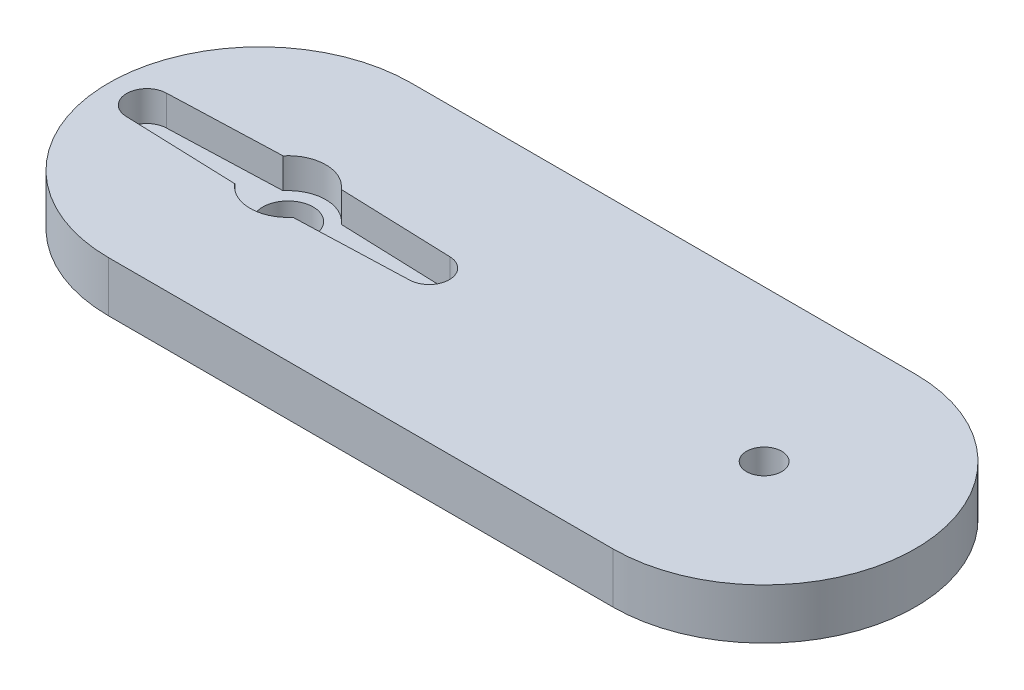
ISO-10303-21;
HEADER;
FILE_DESCRIPTION(('STEP AP214'),'2;1');
FILE_NAME('part.step','',(''),(''),'','','');
FILE_SCHEMA(('AUTOMOTIVE_DESIGN { 1 0 10303 214 1 1 1 1 }'));
ENDSEC;
DATA;
#1=APPLICATION_CONTEXT('core data for automotive mechanical design processes');
#2=APPLICATION_PROTOCOL_DEFINITION('international standard','automotive_design',2000,#1);
#3=PRODUCT_CONTEXT('',#1,'mechanical');
#4=PRODUCT('Part','Part','',(#3));
#5=PRODUCT_RELATED_PRODUCT_CATEGORY('part','',(#4));
#6=PRODUCT_DEFINITION_FORMATION('','',#4);
#7=PRODUCT_DEFINITION_CONTEXT('part definition',#1,'design');
#8=PRODUCT_DEFINITION('design','',#6,#7);
#9=PRODUCT_DEFINITION_SHAPE('','',#8);
#10=(LENGTH_UNIT() NAMED_UNIT(*) SI_UNIT(.MILLI.,.METRE.));
#11=(NAMED_UNIT(*) PLANE_ANGLE_UNIT() SI_UNIT($,.RADIAN.));
#12=(NAMED_UNIT(*) SI_UNIT($,.STERADIAN.) SOLID_ANGLE_UNIT());
#13=UNCERTAINTY_MEASURE_WITH_UNIT(LENGTH_MEASURE(1.E-05),#10,'distance_accuracy_value','');
#14=(GEOMETRIC_REPRESENTATION_CONTEXT(3) GLOBAL_UNCERTAINTY_ASSIGNED_CONTEXT((#13)) GLOBAL_UNIT_ASSIGNED_CONTEXT((#10,
#11,#12)) REPRESENTATION_CONTEXT('',''));
#15=CARTESIAN_POINT('',(0.,0.,0.));
#16=DIRECTION('',(0.,0.,1.));
#17=DIRECTION('',(1.,0.,0.));
#18=AXIS2_PLACEMENT_3D('',#15,#16,#17);
#19=CARTESIAN_POINT('',(0.,5.,0.));
#20=DIRECTION('',(0.,-1.,0.));
#21=DIRECTION('',(0.,0.,-1.));
#22=AXIS2_PLACEMENT_3D('',#19,#20,#21);
#23=PLANE('',#22);
#24=CARTESIAN_POINT('',(0.,5.,0.));
#25=DIRECTION('',(0.,1.,0.));
#26=DIRECTION('',(0.,0.,-1.));
#27=AXIS2_PLACEMENT_3D('',#24,#25,#26);
#28=CIRCLE('',#27,15.);
#29=CARTESIAN_POINT('',(0.,5.,15.));
#30=VERTEX_POINT('',#29);
#31=CARTESIAN_POINT('',(0.,5.,-15.));
#32=VERTEX_POINT('',#31);
#33=EDGE_CURVE('E243',#30,#32,#28,.T.);
#34=ORIENTED_EDGE('',*,*,#33,.T.);
#35=DIRECTION('',(-1.,0.,0.));
#36=VECTOR('',#35,1.);
#37=CARTESIAN_POINT('',(-50.,5.,-15.));
#38=LINE('',#37,#36);
#39=CARTESIAN_POINT('',(-50.,5.,-15.));
#40=VERTEX_POINT('',#39);
#41=EDGE_CURVE('E97',#32,#40,#38,.T.);
#42=ORIENTED_EDGE('',*,*,#41,.T.);
#43=CARTESIAN_POINT('',(-50.,5.,0.));
#44=DIRECTION('',(0.,1.,0.));
#45=DIRECTION('',(0.,0.,1.));
#46=AXIS2_PLACEMENT_3D('',#43,#44,#45);
#47=CIRCLE('',#46,15.);
#48=CARTESIAN_POINT('',(-50.,5.,15.));
#49=VERTEX_POINT('',#48);
#50=EDGE_CURVE('E248',#40,#49,#47,.T.);
#51=ORIENTED_EDGE('',*,*,#50,.T.);
#52=DIRECTION('',(1.,0.,0.));
#53=VECTOR('',#52,1.);
#54=CARTESIAN_POINT('',(-50.,5.,15.));
#55=LINE('',#54,#53);
#56=EDGE_CURVE('E69',#49,#30,#55,.T.);
#57=ORIENTED_EDGE('',*,*,#56,.T.);
#58=EDGE_LOOP('',(#34,#42,#51,#57));
#59=FACE_BOUND('',#58,.T.);
#60=CARTESIAN_POINT('',(0.,5.,0.));
#61=DIRECTION('',(0.,1.,0.));
#62=DIRECTION('',(0.,0.,-1.));
#63=AXIS2_PLACEMENT_3D('',#60,#61,#62);
#64=CIRCLE('',#63,1.75);
#65=CARTESIAN_POINT('',(0.,5.,-1.75000000000001));
#66=VERTEX_POINT('',#65);
#67=EDGE_CURVE('E222',#66,#66,#64,.T.);
#68=ORIENTED_EDGE('',*,*,#67,.F.);
#69=EDGE_LOOP('',(#68));
#70=FACE_BOUND('',#69,.T.);
#71=CARTESIAN_POINT('',(-61.2106377870323,5.,0.));
#72=DIRECTION('',(0.,1.,0.));
#73=DIRECTION('',(0.,0.,1.));
#74=AXIS2_PLACEMENT_3D('',#71,#72,#73);
#75=CIRCLE('',#74,1.99999999999989);
#76=CARTESIAN_POINT('',(-61.2814656274018,5.,1.99874546078984));
#77=VERTEX_POINT('',#76);
#78=CARTESIAN_POINT('',(-61.2814656274019,5.,-1.99874546078982));
#79=VERTEX_POINT('',#78);
#80=EDGE_CURVE('E60',#77,#79,#75,.F.);
#81=ORIENTED_EDGE('',*,*,#80,.T.);
#82=DIRECTION('',(0.999372730394993,0.,-0.0354139201848141));
#83=VECTOR('',#82,1.);
#84=CARTESIAN_POINT('',(-0.147594901167753,5.,-4.16509436409831));
#85=LINE('',#84,#83);
#86=CARTESIAN_POINT('',(-50.0961084973095,5.,-2.39511143376086));
#87=VERTEX_POINT('',#86);
#88=EDGE_CURVE('E163',#79,#87,#85,.T.);
#89=ORIENTED_EDGE('',*,*,#88,.T.);
#90=CARTESIAN_POINT('',(-47.2106377870323,5.,0.));
#91=DIRECTION('',(0.,1.,0.));
#92=DIRECTION('',(0.,0.,1.));
#93=AXIS2_PLACEMENT_3D('',#90,#91,#92);
#94=CIRCLE('',#93,3.74999999999991);
#95=CARTESIAN_POINT('',(-44.3251670767553,5.,-2.39511143376105));
#96=VERTEX_POINT('',#95);
#97=EDGE_CURVE('E212',#96,#87,#94,.T.);
#98=ORIENTED_EDGE('',*,*,#97,.F.);
#99=DIRECTION('',(-0.999372730394995,0.,-0.0354139201847496));
#100=VECTOR('',#99,1.);
#101=CARTESIAN_POINT('',(0.0291768603715252,5.,-0.823364328538849));
#102=LINE('',#101,#100);
#103=CARTESIAN_POINT('',(-33.1398099466627,5.,-1.99874546079073));
#104=VERTEX_POINT('',#103);
#105=EDGE_CURVE('E208',#104,#96,#102,.T.);
#106=ORIENTED_EDGE('',*,*,#105,.F.);
#107=CARTESIAN_POINT('',(-33.2106377870322,5.,-2.6382402541072E-12));
#108=DIRECTION('',(0.,1.,0.));
#109=DIRECTION('',(0.,0.,1.));
#110=AXIS2_PLACEMENT_3D('',#107,#108,#109);
#111=CIRCLE('',#110,1.9999999999981);
#112=CARTESIAN_POINT('',(-33.1398099466627,5.,1.99874546078946));
#113=VERTEX_POINT('',#112);
#114=EDGE_CURVE('E204',#113,#104,#111,.T.);
#115=ORIENTED_EDGE('',*,*,#114,.F.);
#116=DIRECTION('',(-0.999372730394992,0.,0.035413920184841));
#117=VECTOR('',#116,1.);
#118=CARTESIAN_POINT('',(0.0291768603714483,5.,0.823364328534549));
#119=LINE('',#118,#117);
#120=CARTESIAN_POINT('',(-44.3251670767551,5.,2.39511143376081));
#121=VERTEX_POINT('',#120);
#122=EDGE_CURVE('E200',#113,#121,#119,.T.);
#123=ORIENTED_EDGE('',*,*,#122,.T.);
#124=CARTESIAN_POINT('',(-47.2106377870323,5.,0.));
#125=DIRECTION('',(0.,1.,0.));
#126=DIRECTION('',(0.,0.,1.));
#127=AXIS2_PLACEMENT_3D('',#124,#125,#126);
#128=CIRCLE('',#127,3.74999999999992);
#129=CARTESIAN_POINT('',(-50.0961084973095,5.,2.39511143376087));
#130=VERTEX_POINT('',#129);
#131=EDGE_CURVE('E196',#130,#121,#128,.T.);
#132=ORIENTED_EDGE('',*,*,#131,.F.);
#133=DIRECTION('',(0.999372730394993,0.,0.0354139201848138));
#134=VECTOR('',#133,1.);
#135=CARTESIAN_POINT('',(-0.147594901167751,5.,4.1650943640983));
#136=LINE('',#135,#134);
#137=EDGE_CURVE('E192',#77,#130,#136,.T.);
#138=ORIENTED_EDGE('',*,*,#137,.F.);
#139=EDGE_LOOP('',(#81,#89,#98,#106,#115,#123,#132,#138));
#140=FACE_BOUND('',#139,.T.);
#141=ADVANCED_FACE('F43',(#59,#70,#140),#23,.F.);
#142=CARTESIAN_POINT('',(0.,5.,0.));
#143=DIRECTION('',(0.,-1.,0.));
#144=DIRECTION('',(0.,0.,-1.));
#145=AXIS2_PLACEMENT_3D('',#142,#143,#144);
#146=CYLINDRICAL_SURFACE('',#145,15.);
#147=CARTESIAN_POINT('',(0.,0.,0.));
#148=DIRECTION('',(0.,1.,0.));
#149=DIRECTION('',(0.,0.,-1.));
#150=AXIS2_PLACEMENT_3D('',#147,#148,#149);
#151=CIRCLE('',#150,15.);
#152=CARTESIAN_POINT('',(0.,0.,15.));
#153=VERTEX_POINT('',#152);
#154=CARTESIAN_POINT('',(0.,0.,-15.));
#155=VERTEX_POINT('',#154);
#156=EDGE_CURVE('E254',#153,#155,#151,.T.);
#157=ORIENTED_EDGE('',*,*,#156,.T.);
#158=DIRECTION('',(0.,-1.,0.));
#159=VECTOR('',#158,1.);
#160=CARTESIAN_POINT('',(0.,5.,-15.));
#161=LINE('',#160,#159);
#162=EDGE_CURVE('E11',#32,#155,#161,.T.);
#163=ORIENTED_EDGE('',*,*,#162,.F.);
#164=ORIENTED_EDGE('',*,*,#33,.F.);
#165=DIRECTION('',(0.,-1.,0.));
#166=VECTOR('',#165,1.);
#167=CARTESIAN_POINT('',(0.,5.,15.));
#168=LINE('',#167,#166);
#169=EDGE_CURVE('E253',#30,#153,#168,.T.);
#170=ORIENTED_EDGE('',*,*,#169,.T.);
#171=EDGE_LOOP('',(#157,#163,#164,#170));
#172=FACE_BOUND('',#171,.T.);
#173=ADVANCED_FACE('F45',(#172),#146,.T.);
#174=CARTESIAN_POINT('',(-50.,5.,-15.));
#175=DIRECTION('',(0.,0.,1.));
#176=DIRECTION('',(1.,0.,0.));
#177=AXIS2_PLACEMENT_3D('',#174,#175,#176);
#178=PLANE('',#177);
#179=DIRECTION('',(-1.,0.,0.));
#180=VECTOR('',#179,1.);
#181=CARTESIAN_POINT('',(-50.,0.,-15.));
#182=LINE('',#181,#180);
#183=CARTESIAN_POINT('',(-50.,0.,-15.));
#184=VERTEX_POINT('',#183);
#185=EDGE_CURVE('E258',#155,#184,#182,.T.);
#186=ORIENTED_EDGE('',*,*,#185,.T.);
#187=DIRECTION('',(0.,-1.,0.));
#188=VECTOR('',#187,1.);
#189=CARTESIAN_POINT('',(-50.,5.,-15.));
#190=LINE('',#189,#188);
#191=EDGE_CURVE('E53',#40,#184,#190,.T.);
#192=ORIENTED_EDGE('',*,*,#191,.F.);
#193=ORIENTED_EDGE('',*,*,#41,.F.);
#194=ORIENTED_EDGE('',*,*,#162,.T.);
#195=EDGE_LOOP('',(#186,#192,#193,#194));
#196=FACE_BOUND('',#195,.T.);
#197=ADVANCED_FACE('F294',(#196),#178,.F.);
#198=CARTESIAN_POINT('',(-50.,5.,0.));
#199=DIRECTION('',(0.,-1.,0.));
#200=DIRECTION('',(0.,0.,-1.));
#201=AXIS2_PLACEMENT_3D('',#198,#199,#200);
#202=CYLINDRICAL_SURFACE('',#201,15.);
#203=CARTESIAN_POINT('',(-50.,0.,0.));
#204=DIRECTION('',(0.,1.,0.));
#205=DIRECTION('',(0.,0.,1.));
#206=AXIS2_PLACEMENT_3D('',#203,#204,#205);
#207=CIRCLE('',#206,15.);
#208=CARTESIAN_POINT('',(-50.,0.,15.));
#209=VERTEX_POINT('',#208);
#210=EDGE_CURVE('E261',#184,#209,#207,.T.);
#211=ORIENTED_EDGE('',*,*,#210,.T.);
#212=DIRECTION('',(0.,-1.,0.));
#213=VECTOR('',#212,1.);
#214=CARTESIAN_POINT('',(-50.,5.,15.));
#215=LINE('',#214,#213);
#216=EDGE_CURVE('E268',#49,#209,#215,.T.);
#217=ORIENTED_EDGE('',*,*,#216,.F.);
#218=ORIENTED_EDGE('',*,*,#50,.F.);
#219=ORIENTED_EDGE('',*,*,#191,.T.);
#220=EDGE_LOOP('',(#211,#217,#218,#219));
#221=FACE_BOUND('',#220,.T.);
#222=ADVANCED_FACE('F276',(#221),#202,.T.);
#223=CARTESIAN_POINT('',(-50.,5.,15.));
#224=DIRECTION('',(0.,0.,-1.));
#225=DIRECTION('',(-1.,0.,0.));
#226=AXIS2_PLACEMENT_3D('',#223,#224,#225);
#227=PLANE('',#226);
#228=DIRECTION('',(1.,0.,0.));
#229=VECTOR('',#228,1.);
#230=CARTESIAN_POINT('',(-50.,0.,15.));
#231=LINE('',#230,#229);
#232=EDGE_CURVE('E90',#209,#153,#231,.T.);
#233=ORIENTED_EDGE('',*,*,#232,.T.);
#234=ORIENTED_EDGE('',*,*,#169,.F.);
#235=ORIENTED_EDGE('',*,*,#56,.F.);
#236=ORIENTED_EDGE('',*,*,#216,.T.);
#237=EDGE_LOOP('',(#233,#234,#235,#236));
#238=FACE_BOUND('',#237,.T.);
#239=ADVANCED_FACE('F284',(#238),#227,.F.);
#240=CARTESIAN_POINT('',(0.,0.,0.));
#241=DIRECTION('',(0.,-1.,0.));
#242=DIRECTION('',(0.,0.,-1.));
#243=AXIS2_PLACEMENT_3D('',#240,#241,#242);
#244=PLANE('',#243);
#245=CARTESIAN_POINT('',(-47.2106377870323,0.,0.));
#246=DIRECTION('',(0.,1.,0.));
#247=DIRECTION('',(0.,0.,1.));
#248=AXIS2_PLACEMENT_3D('',#245,#246,#247);
#249=CIRCLE('',#248,2.5);
#250=CARTESIAN_POINT('',(-47.2106377870323,0.,2.5));
#251=VERTEX_POINT('',#250);
#252=EDGE_CURVE('E346',#251,#251,#249,.T.);
#253=ORIENTED_EDGE('',*,*,#252,.T.);
#254=EDGE_LOOP('',(#253));
#255=FACE_BOUND('',#254,.T.);
#256=CARTESIAN_POINT('',(0.,0.,0.));
#257=DIRECTION('',(0.,-1.,0.));
#258=DIRECTION('',(0.,0.,-1.));
#259=AXIS2_PLACEMENT_3D('',#256,#257,#258);
#260=CIRCLE('',#259,1.75);
#261=CARTESIAN_POINT('',(0.,0.,-1.75000000000001));
#262=VERTEX_POINT('',#261);
#263=EDGE_CURVE('E47',#262,#262,#260,.T.);
#264=ORIENTED_EDGE('',*,*,#263,.F.);
#265=EDGE_LOOP('',(#264));
#266=FACE_BOUND('',#265,.T.);
#267=ORIENTED_EDGE('',*,*,#156,.F.);
#268=ORIENTED_EDGE('',*,*,#232,.F.);
#269=ORIENTED_EDGE('',*,*,#210,.F.);
#270=ORIENTED_EDGE('',*,*,#185,.F.);
#271=EDGE_LOOP('',(#267,#268,#269,#270));
#272=FACE_BOUND('',#271,.T.);
#273=ADVANCED_FACE('F280',(#255,#266,#272),#244,.T.);
#274=CARTESIAN_POINT('',(0.,-5.,0.));
#275=DIRECTION('',(0.,1.,0.));
#276=DIRECTION('',(0.,0.,1.));
#277=AXIS2_PLACEMENT_3D('',#274,#275,#276);
#278=CYLINDRICAL_SURFACE('',#277,1.75);
#279=ORIENTED_EDGE('',*,*,#263,.T.);
#280=EDGE_LOOP('',(#279));
#281=FACE_BOUND('',#280,.T.);
#282=ORIENTED_EDGE('',*,*,#67,.T.);
#283=EDGE_LOOP('',(#282));
#284=FACE_BOUND('',#283,.T.);
#285=ADVANCED_FACE('F291',(#281,#284),#278,.F.);
#286=CARTESIAN_POINT('',(-61.2106377870323,2.,0.));
#287=DIRECTION('',(0.,1.,0.));
#288=DIRECTION('',(0.,0.,1.));
#289=AXIS2_PLACEMENT_3D('',#286,#287,#288);
#290=CYLINDRICAL_SURFACE('',#289,1.99999999999989);
#291=ORIENTED_EDGE('',*,*,#80,.F.);
#292=DIRECTION('',(0.,1.,0.));
#293=VECTOR('',#292,1.);
#294=CARTESIAN_POINT('',(-61.2814656274018,2.,1.99874546078984));
#295=LINE('',#294,#293);
#296=CARTESIAN_POINT('',(-61.2814656274018,2.,1.99874546078984));
#297=VERTEX_POINT('',#296);
#298=EDGE_CURVE('E142',#297,#77,#295,.T.);
#299=ORIENTED_EDGE('',*,*,#298,.F.);
#300=CARTESIAN_POINT('',(-61.2106377870323,2.,0.));
#301=DIRECTION('',(0.,1.,0.));
#302=DIRECTION('',(0.,0.,1.));
#303=AXIS2_PLACEMENT_3D('',#300,#301,#302);
#304=CIRCLE('',#303,1.99999999999989);
#305=CARTESIAN_POINT('',(-61.2814656274019,2.,-1.99874546078982));
#306=VERTEX_POINT('',#305);
#307=EDGE_CURVE('E145',#297,#306,#304,.F.);
#308=ORIENTED_EDGE('',*,*,#307,.T.);
#309=DIRECTION('',(0.,1.,0.));
#310=VECTOR('',#309,1.);
#311=CARTESIAN_POINT('',(-61.2814656274019,2.,-1.99874546078982));
#312=LINE('',#311,#310);
#313=EDGE_CURVE('E219',#306,#79,#312,.T.);
#314=ORIENTED_EDGE('',*,*,#313,.T.);
#315=EDGE_LOOP('',(#291,#299,#308,#314));
#316=FACE_BOUND('',#315,.T.);
#317=ADVANCED_FACE('F144',(#316),#290,.F.);
#318=CARTESIAN_POINT('',(-0.147594901167753,2.,-4.16509436409831));
#319=DIRECTION('',(0.0354139201848141,0.,0.999372730394993));
#320=DIRECTION('',(0.999372730394993,0.,-0.0354139201848141));
#321=AXIS2_PLACEMENT_3D('',#318,#319,#320);
#322=PLANE('',#321);
#323=ORIENTED_EDGE('',*,*,#88,.F.);
#324=ORIENTED_EDGE('',*,*,#313,.F.);
#325=DIRECTION('',(0.999372730394993,0.,-0.0354139201848141));
#326=VECTOR('',#325,1.);
#327=CARTESIAN_POINT('',(-0.147594901167753,2.,-4.16509436409831));
#328=LINE('',#327,#326);
#329=CARTESIAN_POINT('',(-50.0961084973095,2.,-2.39511143376086));
#330=VERTEX_POINT('',#329);
#331=EDGE_CURVE('E153',#306,#330,#328,.T.);
#332=ORIENTED_EDGE('',*,*,#331,.T.);
#333=DIRECTION('',(0.,1.,0.));
#334=VECTOR('',#333,1.);
#335=CARTESIAN_POINT('',(-50.0961084973095,2.,-2.39511143376086));
#336=LINE('',#335,#334);
#337=EDGE_CURVE('E223',#330,#87,#336,.T.);
#338=ORIENTED_EDGE('',*,*,#337,.T.);
#339=EDGE_LOOP('',(#323,#324,#332,#338));
#340=FACE_BOUND('',#339,.T.);
#341=ADVANCED_FACE('F308',(#340),#322,.T.);
#342=CARTESIAN_POINT('',(-47.2106377870323,2.,0.));
#343=DIRECTION('',(0.,1.,0.));
#344=DIRECTION('',(0.,0.,1.));
#345=AXIS2_PLACEMENT_3D('',#342,#343,#344);
#346=CYLINDRICAL_SURFACE('',#345,3.74999999999991);
#347=ORIENTED_EDGE('',*,*,#97,.T.);
#348=ORIENTED_EDGE('',*,*,#337,.F.);
#349=CARTESIAN_POINT('',(-47.2106377870323,2.,0.));
#350=DIRECTION('',(0.,1.,0.));
#351=DIRECTION('',(0.,0.,1.));
#352=AXIS2_PLACEMENT_3D('',#349,#350,#351);
#353=CIRCLE('',#352,3.74999999999991);
#354=CARTESIAN_POINT('',(-44.3251670767553,2.,-2.39511143376105));
#355=VERTEX_POINT('',#354);
#356=EDGE_CURVE('E185',#355,#330,#353,.T.);
#357=ORIENTED_EDGE('',*,*,#356,.F.);
#358=DIRECTION('',(0.,1.,0.));
#359=VECTOR('',#358,1.);
#360=CARTESIAN_POINT('',(-44.3251670767553,2.,-2.39511143376105));
#361=LINE('',#360,#359);
#362=EDGE_CURVE('E226',#355,#96,#361,.T.);
#363=ORIENTED_EDGE('',*,*,#362,.T.);
#364=EDGE_LOOP('',(#347,#348,#357,#363));
#365=FACE_BOUND('',#364,.T.);
#366=ADVANCED_FACE('F326',(#365),#346,.F.);
#367=CARTESIAN_POINT('',(0.0291768603715252,2.,-0.823364328538849));
#368=DIRECTION('',(0.0354139201847496,0.,-0.999372730394995));
#369=DIRECTION('',(-0.999372730394995,0.,-0.0354139201847496));
#370=AXIS2_PLACEMENT_3D('',#367,#368,#369);
#371=PLANE('',#370);
#372=ORIENTED_EDGE('',*,*,#105,.T.);
#373=ORIENTED_EDGE('',*,*,#362,.F.);
#374=DIRECTION('',(-0.999372730394995,0.,-0.0354139201847496));
#375=VECTOR('',#374,1.);
#376=CARTESIAN_POINT('',(0.0291768603715252,2.,-0.823364328538849));
#377=LINE('',#376,#375);
#378=CARTESIAN_POINT('',(-33.1398099466627,2.,-1.99874546079073));
#379=VERTEX_POINT('',#378);
#380=EDGE_CURVE('E181',#379,#355,#377,.T.);
#381=ORIENTED_EDGE('',*,*,#380,.F.);
#382=DIRECTION('',(0.,1.,0.));
#383=VECTOR('',#382,1.);
#384=CARTESIAN_POINT('',(-33.1398099466627,2.,-1.99874546079073));
#385=LINE('',#384,#383);
#386=EDGE_CURVE('E229',#379,#104,#385,.T.);
#387=ORIENTED_EDGE('',*,*,#386,.T.);
#388=EDGE_LOOP('',(#372,#373,#381,#387));
#389=FACE_BOUND('',#388,.T.);
#390=ADVANCED_FACE('F322',(#389),#371,.F.);
#391=CARTESIAN_POINT('',(-33.2106377870322,2.,-2.6382402541072E-12));
#392=DIRECTION('',(0.,1.,0.));
#393=DIRECTION('',(0.,0.,1.));
#394=AXIS2_PLACEMENT_3D('',#391,#392,#393);
#395=CYLINDRICAL_SURFACE('',#394,1.9999999999981);
#396=ORIENTED_EDGE('',*,*,#114,.T.);
#397=ORIENTED_EDGE('',*,*,#386,.F.);
#398=CARTESIAN_POINT('',(-33.2106377870322,2.,-2.6382402541072E-12));
#399=DIRECTION('',(0.,1.,0.));
#400=DIRECTION('',(0.,0.,1.));
#401=AXIS2_PLACEMENT_3D('',#398,#399,#400);
#402=CIRCLE('',#401,1.9999999999981);
#403=CARTESIAN_POINT('',(-33.1398099466627,2.,1.99874546078946));
#404=VERTEX_POINT('',#403);
#405=EDGE_CURVE('E177',#404,#379,#402,.T.);
#406=ORIENTED_EDGE('',*,*,#405,.F.);
#407=DIRECTION('',(0.,1.,0.));
#408=VECTOR('',#407,1.);
#409=CARTESIAN_POINT('',(-33.1398099466627,2.,1.99874546078946));
#410=LINE('',#409,#408);
#411=EDGE_CURVE('E232',#404,#113,#410,.T.);
#412=ORIENTED_EDGE('',*,*,#411,.T.);
#413=EDGE_LOOP('',(#396,#397,#406,#412));
#414=FACE_BOUND('',#413,.T.);
#415=ADVANCED_FACE('F318',(#414),#395,.F.);
#416=CARTESIAN_POINT('',(0.0291768603714483,2.,0.823364328534549));
#417=DIRECTION('',(-0.035413920184841,0.,-0.999372730394992));
#418=DIRECTION('',(-0.999372730394992,0.,0.035413920184841));
#419=AXIS2_PLACEMENT_3D('',#416,#417,#418);
#420=PLANE('',#419);
#421=ORIENTED_EDGE('',*,*,#122,.F.);
#422=ORIENTED_EDGE('',*,*,#411,.F.);
#423=DIRECTION('',(-0.999372730394992,0.,0.035413920184841));
#424=VECTOR('',#423,1.);
#425=CARTESIAN_POINT('',(0.0291768603714483,2.,0.823364328534549));
#426=LINE('',#425,#424);
#427=CARTESIAN_POINT('',(-44.3251670767551,2.,2.39511143376081));
#428=VERTEX_POINT('',#427);
#429=EDGE_CURVE('E171',#404,#428,#426,.T.);
#430=ORIENTED_EDGE('',*,*,#429,.T.);
#431=DIRECTION('',(0.,1.,0.));
#432=VECTOR('',#431,1.);
#433=CARTESIAN_POINT('',(-44.3251670767551,2.,2.39511143376081));
#434=LINE('',#433,#432);
#435=EDGE_CURVE('E235',#428,#121,#434,.T.);
#436=ORIENTED_EDGE('',*,*,#435,.T.);
#437=EDGE_LOOP('',(#421,#422,#430,#436));
#438=FACE_BOUND('',#437,.T.);
#439=ADVANCED_FACE('F314',(#438),#420,.T.);
#440=CARTESIAN_POINT('',(-47.2106377870323,2.,0.));
#441=DIRECTION('',(0.,1.,0.));
#442=DIRECTION('',(0.,0.,1.));
#443=AXIS2_PLACEMENT_3D('',#440,#441,#442);
#444=CYLINDRICAL_SURFACE('',#443,3.74999999999992);
#445=ORIENTED_EDGE('',*,*,#131,.T.);
#446=ORIENTED_EDGE('',*,*,#435,.F.);
#447=CARTESIAN_POINT('',(-47.2106377870323,2.,0.));
#448=DIRECTION('',(0.,1.,0.));
#449=DIRECTION('',(0.,0.,1.));
#450=AXIS2_PLACEMENT_3D('',#447,#448,#449);
#451=CIRCLE('',#450,3.74999999999992);
#452=CARTESIAN_POINT('',(-50.0961084973095,2.,2.39511143376087));
#453=VERTEX_POINT('',#452);
#454=EDGE_CURVE('E168',#453,#428,#451,.T.);
#455=ORIENTED_EDGE('',*,*,#454,.F.);
#456=DIRECTION('',(0.,1.,0.));
#457=VECTOR('',#456,1.);
#458=CARTESIAN_POINT('',(-50.0961084973095,2.,2.39511143376087));
#459=LINE('',#458,#457);
#460=EDGE_CURVE('E152',#453,#130,#459,.T.);
#461=ORIENTED_EDGE('',*,*,#460,.T.);
#462=EDGE_LOOP('',(#445,#446,#455,#461));
#463=FACE_BOUND('',#462,.T.);
#464=ADVANCED_FACE('F311',(#463),#444,.F.);
#465=CARTESIAN_POINT('',(-0.147594901167751,2.,4.1650943640983));
#466=DIRECTION('',(-0.0354139201848138,0.,0.999372730394993));
#467=DIRECTION('',(0.999372730394993,0.,0.0354139201848138));
#468=AXIS2_PLACEMENT_3D('',#465,#466,#467);
#469=PLANE('',#468);
#470=ORIENTED_EDGE('',*,*,#137,.T.);
#471=ORIENTED_EDGE('',*,*,#460,.F.);
#472=DIRECTION('',(0.999372730394993,0.,0.0354139201848138));
#473=VECTOR('',#472,1.);
#474=CARTESIAN_POINT('',(-0.147594901167751,2.,4.1650943640983));
#475=LINE('',#474,#473);
#476=EDGE_CURVE('E160',#297,#453,#475,.T.);
#477=ORIENTED_EDGE('',*,*,#476,.F.);
#478=ORIENTED_EDGE('',*,*,#298,.T.);
#479=EDGE_LOOP('',(#470,#471,#477,#478));
#480=FACE_BOUND('',#479,.T.);
#481=ADVANCED_FACE('F165',(#480),#469,.F.);
#482=CARTESIAN_POINT('',(0.,2.,0.));
#483=DIRECTION('',(0.,1.,0.));
#484=DIRECTION('',(0.,0.,1.));
#485=AXIS2_PLACEMENT_3D('',#482,#483,#484);
#486=PLANE('',#485);
#487=ORIENTED_EDGE('',*,*,#307,.F.);
#488=ORIENTED_EDGE('',*,*,#476,.T.);
#489=ORIENTED_EDGE('',*,*,#454,.T.);
#490=ORIENTED_EDGE('',*,*,#429,.F.);
#491=ORIENTED_EDGE('',*,*,#405,.T.);
#492=ORIENTED_EDGE('',*,*,#380,.T.);
#493=ORIENTED_EDGE('',*,*,#356,.T.);
#494=ORIENTED_EDGE('',*,*,#331,.F.);
#495=EDGE_LOOP('',(#487,#488,#489,#490,#491,#492,#493,#494));
#496=FACE_BOUND('',#495,.T.);
#497=CARTESIAN_POINT('',(-47.2106377870323,2.,0.));
#498=DIRECTION('',(0.,1.,0.));
#499=DIRECTION('',(0.,0.,1.));
#500=AXIS2_PLACEMENT_3D('',#497,#498,#499);
#501=CIRCLE('',#500,2.5);
#502=CARTESIAN_POINT('',(-47.2106377870323,2.,2.5));
#503=VERTEX_POINT('',#502);
#504=EDGE_CURVE('E193',#503,#503,#501,.T.);
#505=ORIENTED_EDGE('',*,*,#504,.F.);
#506=EDGE_LOOP('',(#505));
#507=FACE_BOUND('',#506,.T.);
#508=ADVANCED_FACE('F157',(#496,#507),#486,.T.);
#509=CARTESIAN_POINT('',(-47.2106377870323,0.,0.));
#510=DIRECTION('',(0.,1.,0.));
#511=DIRECTION('',(0.,0.,1.));
#512=AXIS2_PLACEMENT_3D('',#509,#510,#511);
#513=CYLINDRICAL_SURFACE('',#512,2.5);
#514=ORIENTED_EDGE('',*,*,#504,.T.);
#515=EDGE_LOOP('',(#514));
#516=FACE_BOUND('',#515,.T.);
#517=ORIENTED_EDGE('',*,*,#252,.F.);
#518=EDGE_LOOP('',(#517));
#519=FACE_BOUND('',#518,.T.);
#520=ADVANCED_FACE('F336',(#516,#519),#513,.F.);
#521=CLOSED_SHELL('',(#141,#173,#197,#222,#239,#273,#285,#317,#341,#366,#390,#415,#439,#464,
#481,#508,#520));
#522=MANIFOLD_SOLID_BREP('B2',#521);
#523=ADVANCED_BREP_SHAPE_REPRESENTATION('',(#18,#522),#14);
#524=SHAPE_DEFINITION_REPRESENTATION(#9,#523);
ENDSEC;
END-ISO-10303-21;
